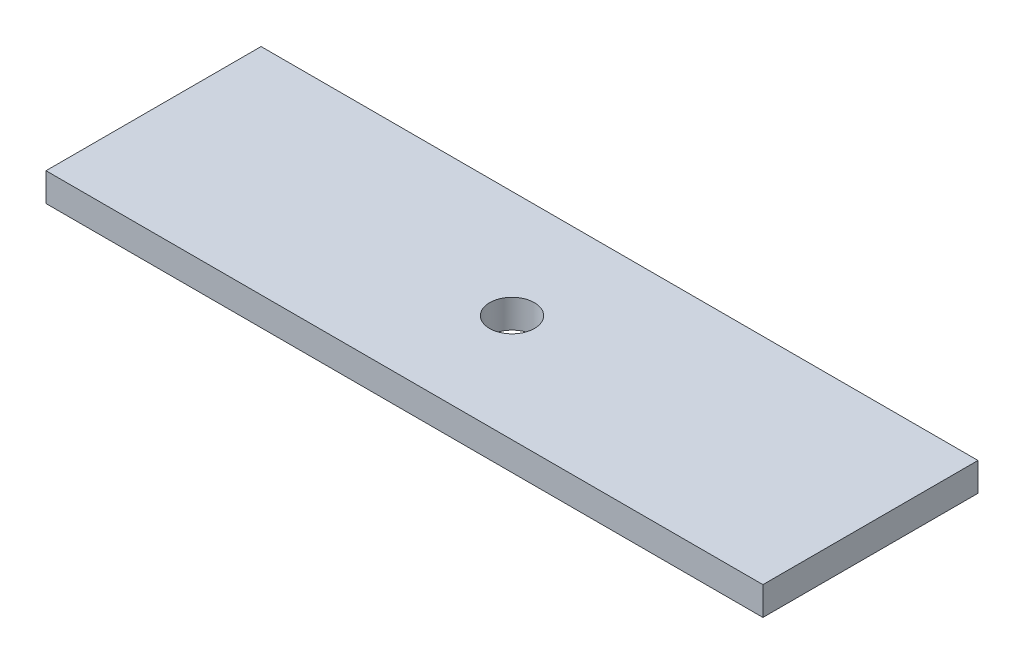
ISO-10303-21;
HEADER;
FILE_DESCRIPTION(('STEP AP214'),'2;1');
FILE_NAME('part.step','',(''),(''),'','','');
FILE_SCHEMA(('AUTOMOTIVE_DESIGN { 1 0 10303 214 1 1 1 1 }'));
ENDSEC;
DATA;
#1=APPLICATION_CONTEXT('core data for automotive mechanical design processes');
#2=APPLICATION_PROTOCOL_DEFINITION('international standard','automotive_design',2000,#1);
#3=PRODUCT_CONTEXT('',#1,'mechanical');
#4=PRODUCT('Part','Part','',(#3));
#5=PRODUCT_RELATED_PRODUCT_CATEGORY('part','',(#4));
#6=PRODUCT_DEFINITION_FORMATION('','',#4);
#7=PRODUCT_DEFINITION_CONTEXT('part definition',#1,'design');
#8=PRODUCT_DEFINITION('design','',#6,#7);
#9=PRODUCT_DEFINITION_SHAPE('','',#8);
#10=(LENGTH_UNIT() NAMED_UNIT(*) SI_UNIT(.MILLI.,.METRE.));
#11=(NAMED_UNIT(*) PLANE_ANGLE_UNIT() SI_UNIT($,.RADIAN.));
#12=(NAMED_UNIT(*) SI_UNIT($,.STERADIAN.) SOLID_ANGLE_UNIT());
#13=UNCERTAINTY_MEASURE_WITH_UNIT(LENGTH_MEASURE(1.E-05),#10,'distance_accuracy_value','');
#14=(GEOMETRIC_REPRESENTATION_CONTEXT(3) GLOBAL_UNCERTAINTY_ASSIGNED_CONTEXT((#13)) GLOBAL_UNIT_ASSIGNED_CONTEXT((#10,
#11,#12)) REPRESENTATION_CONTEXT('',''));
#15=CARTESIAN_POINT('',(0.,0.,0.));
#16=DIRECTION('',(0.,0.,1.));
#17=DIRECTION('',(1.,0.,0.));
#18=AXIS2_PLACEMENT_3D('',#15,#16,#17);
#19=CARTESIAN_POINT('',(0.,1.58749999999995,0.));
#20=DIRECTION('',(0.,1.,0.));
#21=DIRECTION('',(0.,0.,0.999999999999999));
#22=AXIS2_PLACEMENT_3D('',#19,#20,#21);
#23=PLANE('',#22);
#24=DIRECTION('',(0.,0.,-0.999999999999999));
#25=VECTOR('',#24,1.);
#26=CARTESIAN_POINT('',(20.,1.58749999999999,-6.00000000000001));
#27=LINE('',#26,#25);
#28=CARTESIAN_POINT('',(20.,1.58749999999999,6.00000000000003));
#29=VERTEX_POINT('',#28);
#30=CARTESIAN_POINT('',(20.,1.58749999999999,-6.00000000000001));
#31=VERTEX_POINT('',#30);
#32=EDGE_CURVE('E88',#29,#31,#27,.T.);
#33=ORIENTED_EDGE('',*,*,#32,.T.);
#34=DIRECTION('',(-1.,0.,0.));
#35=VECTOR('',#34,1.);
#36=CARTESIAN_POINT('',(-20.,1.58749999999999,-6.00000000000001));
#37=LINE('',#36,#35);
#38=CARTESIAN_POINT('',(-20.,1.58749999999999,-6.00000000000001));
#39=VERTEX_POINT('',#38);
#40=EDGE_CURVE('E83',#31,#39,#37,.T.);
#41=ORIENTED_EDGE('',*,*,#40,.T.);
#42=DIRECTION('',(0.,0.,0.999999999999999));
#43=VECTOR('',#42,1.);
#44=CARTESIAN_POINT('',(-20.,1.58749999999999,-6.00000000000001));
#45=LINE('',#44,#43);
#46=CARTESIAN_POINT('',(-20.,1.58749999999999,5.99999999999998));
#47=VERTEX_POINT('',#46);
#48=EDGE_CURVE('E86',#39,#47,#45,.T.);
#49=ORIENTED_EDGE('',*,*,#48,.T.);
#50=DIRECTION('',(1.,0.,0.));
#51=VECTOR('',#50,1.);
#52=CARTESIAN_POINT('',(-20.,1.58749999999999,5.99999999999998));
#53=LINE('',#52,#51);
#54=EDGE_CURVE('E53',#47,#29,#53,.T.);
#55=ORIENTED_EDGE('',*,*,#54,.T.);
#56=EDGE_LOOP('',(#33,#41,#49,#55));
#57=FACE_BOUND('',#56,.T.);
#58=CARTESIAN_POINT('',(0.,1.58749999999995,0.));
#59=DIRECTION('',(0.,1.,0.));
#60=DIRECTION('',(0.,0.,0.999999999999999));
#61=AXIS2_PLACEMENT_3D('',#58,#59,#60);
#62=CIRCLE('',#61,1.25);
#63=CARTESIAN_POINT('',(0.,1.58749999999995,1.24999999999997));
#64=VERTEX_POINT('',#63);
#65=EDGE_CURVE('E103',#64,#64,#62,.T.);
#66=ORIENTED_EDGE('',*,*,#65,.F.);
#67=EDGE_LOOP('',(#66));
#68=FACE_BOUND('',#67,.T.);
#69=ADVANCED_FACE('F36',(#57,#68),#23,.T.);
#70=CARTESIAN_POINT('',(0.,0.,0.));
#71=DIRECTION('',(0.,1.,0.));
#72=DIRECTION('',(0.,0.,0.999999999999999));
#73=AXIS2_PLACEMENT_3D('',#70,#71,#72);
#74=PLANE('',#73);
#75=DIRECTION('',(0.,0.,-0.999999999999999));
#76=VECTOR('',#75,1.);
#77=CARTESIAN_POINT('',(20.,0.,-6.00000000000001));
#78=LINE('',#77,#76);
#79=CARTESIAN_POINT('',(20.,0.,5.99999999999998));
#80=VERTEX_POINT('',#79);
#81=CARTESIAN_POINT('',(20.,0.,-6.00000000000001));
#82=VERTEX_POINT('',#81);
#83=EDGE_CURVE('E100',#80,#82,#78,.T.);
#84=ORIENTED_EDGE('',*,*,#83,.F.);
#85=DIRECTION('',(1.,0.,0.));
#86=VECTOR('',#85,1.);
#87=CARTESIAN_POINT('',(-20.,0.,5.99999999999998));
#88=LINE('',#87,#86);
#89=CARTESIAN_POINT('',(-20.,0.,5.99999999999998));
#90=VERTEX_POINT('',#89);
#91=EDGE_CURVE('E76',#90,#80,#88,.T.);
#92=ORIENTED_EDGE('',*,*,#91,.F.);
#93=DIRECTION('',(0.,0.,0.999999999999999));
#94=VECTOR('',#93,1.);
#95=CARTESIAN_POINT('',(-20.,0.,-5.99999999999995));
#96=LINE('',#95,#94);
#97=CARTESIAN_POINT('',(-20.,0.,-5.99999999999995));
#98=VERTEX_POINT('',#97);
#99=EDGE_CURVE('E70',#98,#90,#96,.T.);
#100=ORIENTED_EDGE('',*,*,#99,.F.);
#101=DIRECTION('',(-1.,0.,0.));
#102=VECTOR('',#101,1.);
#103=CARTESIAN_POINT('',(-20.,0.,-5.99999999999995));
#104=LINE('',#103,#102);
#105=EDGE_CURVE('E92',#82,#98,#104,.T.);
#106=ORIENTED_EDGE('',*,*,#105,.F.);
#107=EDGE_LOOP('',(#84,#92,#100,#106));
#108=FACE_BOUND('',#107,.T.);
#109=CARTESIAN_POINT('',(0.,0.,0.));
#110=DIRECTION('',(0.,1.,0.));
#111=DIRECTION('',(0.,0.,0.999999999999999));
#112=AXIS2_PLACEMENT_3D('',#109,#110,#111);
#113=CIRCLE('',#112,1.25);
#114=CARTESIAN_POINT('',(0.,0.,1.25));
#115=VERTEX_POINT('',#114);
#116=EDGE_CURVE('E115',#115,#115,#113,.T.);
#117=ORIENTED_EDGE('',*,*,#116,.T.);
#118=EDGE_LOOP('',(#117));
#119=FACE_BOUND('',#118,.T.);
#120=ADVANCED_FACE('F111',(#108,#119),#74,.F.);
#121=CARTESIAN_POINT('',(20.,1.58749999999999,-6.00000000000001));
#122=DIRECTION('',(-1.,0.,0.));
#123=DIRECTION('',(0.,0.,0.999999999999999));
#124=AXIS2_PLACEMENT_3D('',#121,#122,#123);
#125=PLANE('',#124);
#126=ORIENTED_EDGE('',*,*,#83,.T.);
#127=DIRECTION('',(0.,-1.,0.));
#128=VECTOR('',#127,1.);
#129=CARTESIAN_POINT('',(20.,1.58749999999999,-6.00000000000001));
#130=LINE('',#129,#128);
#131=EDGE_CURVE('E11',#31,#82,#130,.T.);
#132=ORIENTED_EDGE('',*,*,#131,.F.);
#133=ORIENTED_EDGE('',*,*,#32,.F.);
#134=DIRECTION('',(0.,-1.,0.));
#135=VECTOR('',#134,1.);
#136=CARTESIAN_POINT('',(20.,1.58749999999999,6.00000000000003));
#137=LINE('',#136,#135);
#138=EDGE_CURVE('E96',#29,#80,#137,.T.);
#139=ORIENTED_EDGE('',*,*,#138,.T.);
#140=EDGE_LOOP('',(#126,#132,#133,#139));
#141=FACE_BOUND('',#140,.T.);
#142=ADVANCED_FACE('F38',(#141),#125,.F.);
#143=CARTESIAN_POINT('',(-20.,1.58749999999999,-6.00000000000001));
#144=DIRECTION('',(0.,0.,0.999999999999999));
#145=DIRECTION('',(1.,0.,0.));
#146=AXIS2_PLACEMENT_3D('',#143,#144,#145);
#147=PLANE('',#146);
#148=ORIENTED_EDGE('',*,*,#105,.T.);
#149=DIRECTION('',(0.,-1.,0.));
#150=VECTOR('',#149,1.);
#151=CARTESIAN_POINT('',(-20.,1.58749999999999,-6.00000000000001));
#152=LINE('',#151,#150);
#153=EDGE_CURVE('E45',#39,#98,#152,.T.);
#154=ORIENTED_EDGE('',*,*,#153,.F.);
#155=ORIENTED_EDGE('',*,*,#40,.F.);
#156=ORIENTED_EDGE('',*,*,#131,.T.);
#157=EDGE_LOOP('',(#148,#154,#155,#156));
#158=FACE_BOUND('',#157,.T.);
#159=ADVANCED_FACE('F91',(#158),#147,.F.);
#160=CARTESIAN_POINT('',(-20.,1.58749999999999,-6.00000000000001));
#161=DIRECTION('',(1.,0.,0.));
#162=DIRECTION('',(0.,0.,-0.999999999999999));
#163=AXIS2_PLACEMENT_3D('',#160,#161,#162);
#164=PLANE('',#163);
#165=ORIENTED_EDGE('',*,*,#99,.T.);
#166=DIRECTION('',(0.,-1.,0.));
#167=VECTOR('',#166,1.);
#168=CARTESIAN_POINT('',(-20.,1.58749999999999,5.99999999999998));
#169=LINE('',#168,#167);
#170=EDGE_CURVE('E93',#47,#90,#169,.T.);
#171=ORIENTED_EDGE('',*,*,#170,.F.);
#172=ORIENTED_EDGE('',*,*,#48,.F.);
#173=ORIENTED_EDGE('',*,*,#153,.T.);
#174=EDGE_LOOP('',(#165,#171,#172,#173));
#175=FACE_BOUND('',#174,.T.);
#176=ADVANCED_FACE('F94',(#175),#164,.F.);
#177=CARTESIAN_POINT('',(-20.,1.58749999999999,5.99999999999998));
#178=DIRECTION('',(0.,0.,-0.999999999999999));
#179=DIRECTION('',(-1.,0.,0.));
#180=AXIS2_PLACEMENT_3D('',#177,#178,#179);
#181=PLANE('',#180);
#182=ORIENTED_EDGE('',*,*,#91,.T.);
#183=ORIENTED_EDGE('',*,*,#138,.F.);
#184=ORIENTED_EDGE('',*,*,#54,.F.);
#185=ORIENTED_EDGE('',*,*,#170,.T.);
#186=EDGE_LOOP('',(#182,#183,#184,#185));
#187=FACE_BOUND('',#186,.T.);
#188=ADVANCED_FACE('F108',(#187),#181,.F.);
#189=CARTESIAN_POINT('',(0.,1.58749999999995,0.));
#190=DIRECTION('',(0.,-1.,0.));
#191=DIRECTION('',(0.,0.,-0.999999999999999));
#192=AXIS2_PLACEMENT_3D('',#189,#190,#191);
#193=CYLINDRICAL_SURFACE('',#192,1.25);
#194=ORIENTED_EDGE('',*,*,#65,.T.);
#195=EDGE_LOOP('',(#194));
#196=FACE_BOUND('',#195,.T.);
#197=ORIENTED_EDGE('',*,*,#116,.F.);
#198=EDGE_LOOP('',(#197));
#199=FACE_BOUND('',#198,.T.);
#200=ADVANCED_FACE('F121',(#196,#199),#193,.F.);
#201=CLOSED_SHELL('',(#69,#120,#142,#159,#176,#188,#200));
#202=MANIFOLD_SOLID_BREP('B2',#201);
#203=ADVANCED_BREP_SHAPE_REPRESENTATION('',(#18,#202),#14);
#204=SHAPE_DEFINITION_REPRESENTATION(#9,#203);
ENDSEC;
END-ISO-10303-21;
